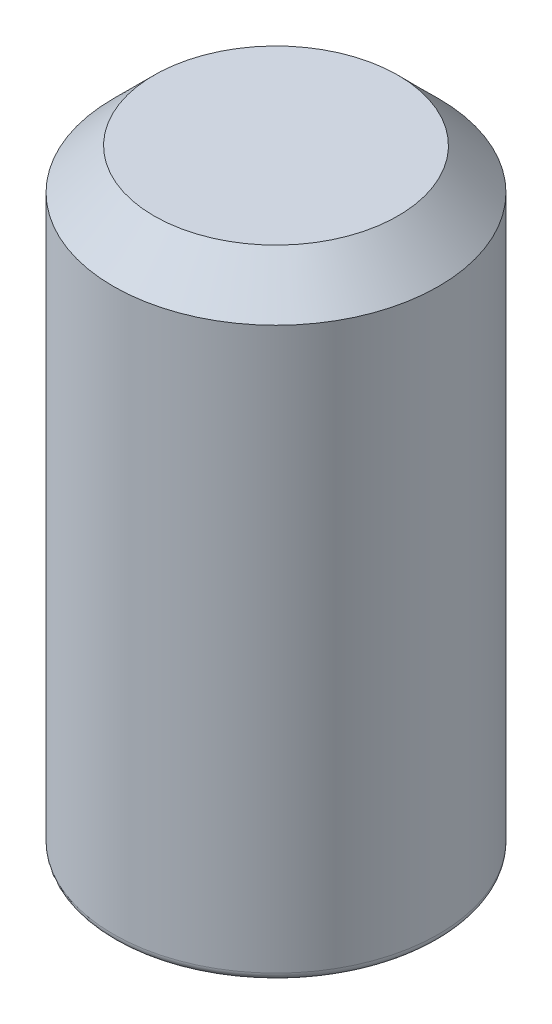
ISO-10303-21;
HEADER;
FILE_DESCRIPTION(('STEP AP214'),'2;1');
FILE_NAME('part.step','',(''),(''),'','','');
FILE_SCHEMA(('AUTOMOTIVE_DESIGN { 1 0 10303 214 1 1 1 1 }'));
ENDSEC;
DATA;
#1=APPLICATION_CONTEXT('core data for automotive mechanical design processes');
#2=APPLICATION_PROTOCOL_DEFINITION('international standard','automotive_design',2000,#1);
#3=PRODUCT_CONTEXT('',#1,'mechanical');
#4=PRODUCT('Part','Part','',(#3));
#5=PRODUCT_RELATED_PRODUCT_CATEGORY('part','',(#4));
#6=PRODUCT_DEFINITION_FORMATION('','',#4);
#7=PRODUCT_DEFINITION_CONTEXT('part definition',#1,'design');
#8=PRODUCT_DEFINITION('design','',#6,#7);
#9=PRODUCT_DEFINITION_SHAPE('','',#8);
#10=(LENGTH_UNIT() NAMED_UNIT(*) SI_UNIT(.MILLI.,.METRE.));
#11=(NAMED_UNIT(*) PLANE_ANGLE_UNIT() SI_UNIT($,.RADIAN.));
#12=(NAMED_UNIT(*) SI_UNIT($,.STERADIAN.) SOLID_ANGLE_UNIT());
#13=UNCERTAINTY_MEASURE_WITH_UNIT(LENGTH_MEASURE(1.E-05),#10,'distance_accuracy_value','');
#14=(GEOMETRIC_REPRESENTATION_CONTEXT(3) GLOBAL_UNCERTAINTY_ASSIGNED_CONTEXT((#13)) GLOBAL_UNIT_ASSIGNED_CONTEXT((#10,
#11,#12)) REPRESENTATION_CONTEXT('',''));
#15=CARTESIAN_POINT('',(0.,0.,0.));
#16=DIRECTION('',(0.,0.,1.));
#17=DIRECTION('',(1.,0.,0.));
#18=AXIS2_PLACEMENT_3D('',#15,#16,#17);
#19=CARTESIAN_POINT('',(0.,15.,0.));
#20=DIRECTION('',(0.,-1.,0.));
#21=DIRECTION('',(0.,0.,-1.));
#22=AXIS2_PLACEMENT_3D('',#19,#20,#21);
#23=CYLINDRICAL_SURFACE('',#22,4.);
#24=CARTESIAN_POINT('',(0.,0.200000000000001,0.));
#25=DIRECTION('',(0.,1.,0.));
#26=DIRECTION('',(0.,0.,1.));
#27=AXIS2_PLACEMENT_3D('',#24,#25,#26);
#28=CIRCLE('',#27,4.);
#29=CARTESIAN_POINT('',(0.,0.200000000000001,4.));
#30=VERTEX_POINT('',#29);
#31=EDGE_CURVE('E49',#30,#30,#28,.T.);
#32=ORIENTED_EDGE('',*,*,#31,.T.);
#33=EDGE_LOOP('',(#32));
#34=FACE_BOUND('',#33,.T.);
#35=CARTESIAN_POINT('',(0.,14.,0.));
#36=DIRECTION('',(0.,1.,0.));
#37=DIRECTION('',(0.,0.,1.));
#38=AXIS2_PLACEMENT_3D('',#35,#36,#37);
#39=CIRCLE('',#38,4.);
#40=CARTESIAN_POINT('',(0.,14.,4.));
#41=VERTEX_POINT('',#40);
#42=EDGE_CURVE('E53',#41,#41,#39,.F.);
#43=ORIENTED_EDGE('',*,*,#42,.T.);
#44=EDGE_LOOP('',(#43));
#45=FACE_BOUND('',#44,.T.);
#46=ADVANCED_FACE('F43',(#34,#45),#23,.T.);
#47=CARTESIAN_POINT('',(0.,15.,0.));
#48=DIRECTION('',(0.,1.,0.));
#49=DIRECTION('',(0.,0.,1.));
#50=AXIS2_PLACEMENT_3D('',#47,#48,#49);
#51=PLANE('',#50);
#52=CARTESIAN_POINT('',(0.,15.,0.));
#53=DIRECTION('',(0.,1.,0.));
#54=DIRECTION('',(0.,0.,1.));
#55=AXIS2_PLACEMENT_3D('',#52,#53,#54);
#56=CIRCLE('',#55,3.);
#57=CARTESIAN_POINT('',(0.,15.,3.));
#58=VERTEX_POINT('',#57);
#59=EDGE_CURVE('E59',#58,#58,#56,.T.);
#60=ORIENTED_EDGE('',*,*,#59,.T.);
#61=EDGE_LOOP('',(#60));
#62=FACE_BOUND('',#61,.T.);
#63=ADVANCED_FACE('F65',(#62),#51,.T.);
#64=CARTESIAN_POINT('',(0.,0.,0.));
#65=DIRECTION('',(0.,1.,0.));
#66=DIRECTION('',(0.,0.,1.));
#67=AXIS2_PLACEMENT_3D('',#64,#65,#66);
#68=PLANE('',#67);
#69=CARTESIAN_POINT('',(0.,0.,0.));
#70=DIRECTION('',(0.,1.,0.));
#71=DIRECTION('',(0.,0.,1.));
#72=AXIS2_PLACEMENT_3D('',#69,#70,#71);
#73=CIRCLE('',#72,3.8);
#74=CARTESIAN_POINT('',(0.,0.,3.8));
#75=VERTEX_POINT('',#74);
#76=EDGE_CURVE('E10',#75,#75,#73,.F.);
#77=ORIENTED_EDGE('',*,*,#76,.T.);
#78=EDGE_LOOP('',(#77));
#79=FACE_BOUND('',#78,.T.);
#80=ADVANCED_FACE('F68',(#79),#68,.F.);
#81=CARTESIAN_POINT('',(0.,15.,0.));
#82=DIRECTION('',(0.,-1.,0.));
#83=DIRECTION('',(0.,0.,-1.));
#84=AXIS2_PLACEMENT_3D('',#81,#82,#83);
#85=CONICAL_SURFACE('',#84,3.,0.785398163397447);
#86=ORIENTED_EDGE('',*,*,#42,.F.);
#87=EDGE_LOOP('',(#86));
#88=FACE_BOUND('',#87,.T.);
#89=ORIENTED_EDGE('',*,*,#59,.F.);
#90=EDGE_LOOP('',(#89));
#91=FACE_BOUND('',#90,.T.);
#92=ADVANCED_FACE('F66',(#88,#91),#85,.T.);
#93=CARTESIAN_POINT('',(0.,0.200000000000001,0.));
#94=DIRECTION('',(0.,1.,0.));
#95=DIRECTION('',(0.,0.,1.));
#96=AXIS2_PLACEMENT_3D('',#93,#94,#95);
#97=TOROIDAL_SURFACE('',#96,3.8,0.2);
#98=ORIENTED_EDGE('',*,*,#76,.F.);
#99=EDGE_LOOP('',(#98));
#100=FACE_BOUND('',#99,.T.);
#101=ORIENTED_EDGE('',*,*,#31,.F.);
#102=EDGE_LOOP('',(#101));
#103=FACE_BOUND('',#102,.T.);
#104=ADVANCED_FACE('F44',(#100,#103),#97,.T.);
#105=CLOSED_SHELL('',(#46,#63,#80,#92,#104));
#106=MANIFOLD_SOLID_BREP('B2',#105);
#107=ADVANCED_BREP_SHAPE_REPRESENTATION('',(#18,#106),#14);
#108=SHAPE_DEFINITION_REPRESENTATION(#9,#107);
ENDSEC;
END-ISO-10303-21;
